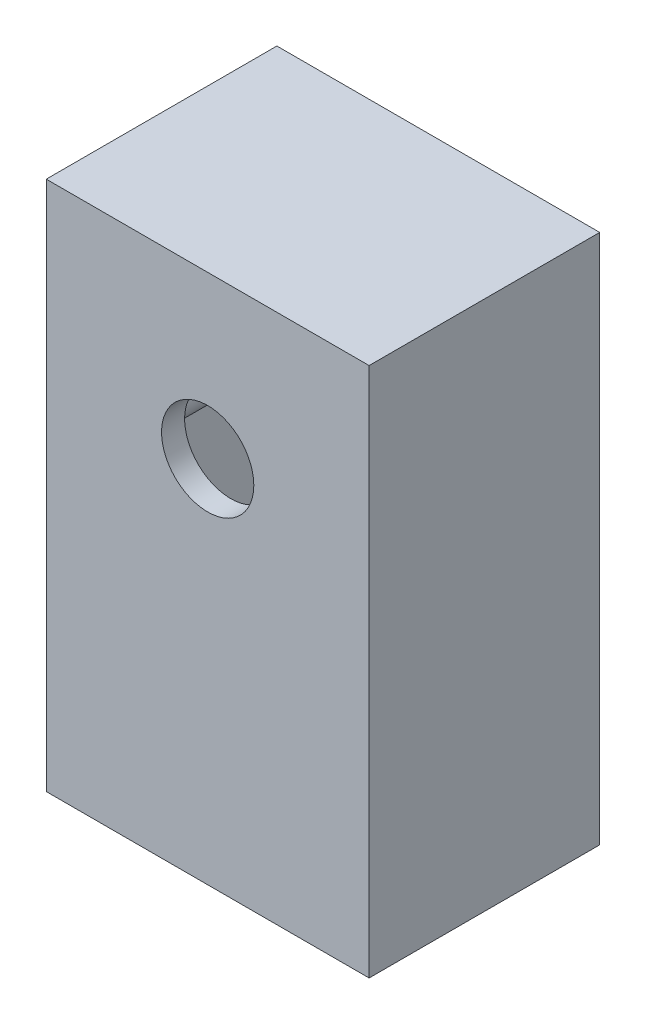
ISO-10303-21;
HEADER;
FILE_DESCRIPTION(('STEP AP214'),'2;1');
FILE_NAME('part.step','',(''),(''),'','','');
FILE_SCHEMA(('AUTOMOTIVE_DESIGN { 1 0 10303 214 1 1 1 1 }'));
ENDSEC;
DATA;
#1=APPLICATION_CONTEXT('core data for automotive mechanical design processes');
#2=APPLICATION_PROTOCOL_DEFINITION('international standard','automotive_design',2000,#1);
#3=PRODUCT_CONTEXT('',#1,'mechanical');
#4=PRODUCT('Part','Part','',(#3));
#5=PRODUCT_RELATED_PRODUCT_CATEGORY('part','',(#4));
#6=PRODUCT_DEFINITION_FORMATION('','',#4);
#7=PRODUCT_DEFINITION_CONTEXT('part definition',#1,'design');
#8=PRODUCT_DEFINITION('design','',#6,#7);
#9=PRODUCT_DEFINITION_SHAPE('','',#8);
#10=(LENGTH_UNIT() NAMED_UNIT(*) SI_UNIT(.MILLI.,.METRE.));
#11=(NAMED_UNIT(*) PLANE_ANGLE_UNIT() SI_UNIT($,.RADIAN.));
#12=(NAMED_UNIT(*) SI_UNIT($,.STERADIAN.) SOLID_ANGLE_UNIT());
#13=UNCERTAINTY_MEASURE_WITH_UNIT(LENGTH_MEASURE(1.E-05),#10,'distance_accuracy_value','');
#14=(GEOMETRIC_REPRESENTATION_CONTEXT(3) GLOBAL_UNCERTAINTY_ASSIGNED_CONTEXT((#13)) GLOBAL_UNIT_ASSIGNED_CONTEXT((#10,
#11,#12)) REPRESENTATION_CONTEXT('',''));
#15=CARTESIAN_POINT('',(0.,0.,0.));
#16=DIRECTION('',(0.,0.,1.));
#17=DIRECTION('',(1.,0.,0.));
#18=AXIS2_PLACEMENT_3D('',#15,#16,#17);
#19=CARTESIAN_POINT('',(0.,0.,-1000.));
#20=DIRECTION('',(0.,0.,1.));
#21=DIRECTION('',(1.,0.,0.));
#22=AXIS2_PLACEMENT_3D('',#19,#20,#21);
#23=PLANE('',#22);
#24=CARTESIAN_POINT('',(124743.416897498,168337.836627923,-1000.));
#25=DIRECTION('',(0.,0.,1.));
#26=DIRECTION('',(1.,0.,0.));
#27=AXIS2_PLACEMENT_3D('',#24,#25,#26);
#28=CIRCLE('',#27,2000.);
#29=CARTESIAN_POINT('',(126743.416897498,168337.836627923,-1000.));
#30=VERTEX_POINT('',#29);
#31=EDGE_CURVE('E435',#30,#30,#28,.T.);
#32=ORIENTED_EDGE('',*,*,#31,.T.);
#33=EDGE_LOOP('',(#32));
#34=FACE_BOUND('',#33,.T.);
#35=DIRECTION('',(0.,-1.,0.));
#36=VECTOR('',#35,1.);
#37=CARTESIAN_POINT('',(120743.416897498,157337.836627923,-1000.));
#38=LINE('',#37,#36);
#39=CARTESIAN_POINT('',(120743.416897498,157337.836627923,-1000.));
#40=VERTEX_POINT('',#39);
#41=CARTESIAN_POINT('',(120743.416897498,156337.836627923,-1000.));
#42=VERTEX_POINT('',#41);
#43=EDGE_CURVE('E257',#40,#42,#38,.T.);
#44=ORIENTED_EDGE('',*,*,#43,.F.);
#45=DIRECTION('',(-1.,0.,0.));
#46=VECTOR('',#45,1.);
#47=CARTESIAN_POINT('',(-1.48029736616685E-13,157337.836627923,-999.999999999984));
#48=LINE('',#47,#46);
#49=CARTESIAN_POINT('',(118743.416897498,157337.836627923,-1000.));
#50=VERTEX_POINT('',#49);
#51=EDGE_CURVE('E267',#40,#50,#48,.T.);
#52=ORIENTED_EDGE('',*,*,#51,.T.);
#53=DIRECTION('',(0.,1.,0.));
#54=VECTOR('',#53,1.);
#55=CARTESIAN_POINT('',(118743.416897498,0.,-1000.));
#56=LINE('',#55,#54);
#57=CARTESIAN_POINT('',(118743.416897498,166437.836627923,-1000.));
#58=VERTEX_POINT('',#57);
#59=EDGE_CURVE('E445',#50,#58,#56,.T.);
#60=ORIENTED_EDGE('',*,*,#59,.T.);
#61=DIRECTION('',(-1.,0.,0.));
#62=VECTOR('',#61,1.);
#63=CARTESIAN_POINT('',(0.,166437.836627923,-1000.));
#64=LINE('',#63,#62);
#65=CARTESIAN_POINT('',(120243.416897498,166437.836627923,-1000.));
#66=VERTEX_POINT('',#65);
#67=EDGE_CURVE('E490',#66,#58,#64,.T.);
#68=ORIENTED_EDGE('',*,*,#67,.F.);
#69=CARTESIAN_POINT('',(120243.416897498,167837.836627923,-1000.));
#70=DIRECTION('',(0.,0.,1.));
#71=DIRECTION('',(1.,0.,0.));
#72=AXIS2_PLACEMENT_3D('',#69,#70,#71);
#73=CIRCLE('',#72,1400.00000000001);
#74=CARTESIAN_POINT('',(121643.416897498,167837.836627923,-1000.));
#75=VERTEX_POINT('',#74);
#76=EDGE_CURVE('E487',#75,#66,#73,.F.);
#77=ORIENTED_EDGE('',*,*,#76,.F.);
#78=DIRECTION('',(0.,-1.,0.));
#79=VECTOR('',#78,1.);
#80=CARTESIAN_POINT('',(121643.416897501,1.72865692459113E-09,-1000.));
#81=LINE('',#80,#79);
#82=CARTESIAN_POINT('',(121643.416897498,168837.836627923,-1000.));
#83=VERTEX_POINT('',#82);
#84=EDGE_CURVE('E484',#83,#75,#81,.T.);
#85=ORIENTED_EDGE('',*,*,#84,.F.);
#86=CARTESIAN_POINT('',(120243.416897498,168837.836627923,-1000.));
#87=DIRECTION('',(0.,0.,1.));
#88=DIRECTION('',(1.,0.,0.));
#89=AXIS2_PLACEMENT_3D('',#86,#87,#88);
#90=CIRCLE('',#89,1400.00000000001);
#91=CARTESIAN_POINT('',(120243.416897498,170237.836627923,-1000.));
#92=VERTEX_POINT('',#91);
#93=EDGE_CURVE('E481',#92,#83,#90,.F.);
#94=ORIENTED_EDGE('',*,*,#93,.F.);
#95=DIRECTION('',(1.,0.,0.));
#96=VECTOR('',#95,1.);
#97=CARTESIAN_POINT('',(0.,170237.836627923,-1000.));
#98=LINE('',#97,#96);
#99=CARTESIAN_POINT('',(118743.416897498,170237.836627923,-1000.));
#100=VERTEX_POINT('',#99);
#101=EDGE_CURVE('E478',#100,#92,#98,.T.);
#102=ORIENTED_EDGE('',*,*,#101,.F.);
#103=DIRECTION('',(0.,1.,0.));
#104=VECTOR('',#103,1.);
#105=CARTESIAN_POINT('',(118743.416897499,4.11572059979761E-10,-1000.));
#106=LINE('',#105,#104);
#107=CARTESIAN_POINT('',(118743.416897498,174337.836627923,-1000.));
#108=VERTEX_POINT('',#107);
#109=EDGE_CURVE('E476',#100,#108,#106,.T.);
#110=ORIENTED_EDGE('',*,*,#109,.T.);
#111=DIRECTION('',(1.,0.,0.));
#112=VECTOR('',#111,1.);
#113=CARTESIAN_POINT('',(0.,174337.836627923,-1000.));
#114=LINE('',#113,#112);
#115=CARTESIAN_POINT('',(122843.416897498,174337.836627923,-1000.));
#116=VERTEX_POINT('',#115);
#117=EDGE_CURVE('E474',#108,#116,#114,.T.);
#118=ORIENTED_EDGE('',*,*,#117,.T.);
#119=DIRECTION('',(0.,-1.,0.));
#120=VECTOR('',#119,1.);
#121=CARTESIAN_POINT('',(122843.416897498,0.,-1000.));
#122=LINE('',#121,#120);
#123=CARTESIAN_POINT('',(122843.416897498,172837.836627923,-1000.));
#124=VERTEX_POINT('',#123);
#125=EDGE_CURVE('E472',#116,#124,#122,.T.);
#126=ORIENTED_EDGE('',*,*,#125,.T.);
#127=CARTESIAN_POINT('',(124243.416897498,172837.836627923,-1000.));
#128=DIRECTION('',(0.,0.,1.));
#129=DIRECTION('',(1.,0.,0.));
#130=AXIS2_PLACEMENT_3D('',#127,#128,#129);
#131=CIRCLE('',#130,1400.00000000001);
#132=CARTESIAN_POINT('',(124243.416897498,171437.836627923,-1000.));
#133=VERTEX_POINT('',#132);
#134=EDGE_CURVE('E470',#124,#133,#131,.T.);
#135=ORIENTED_EDGE('',*,*,#134,.T.);
#136=DIRECTION('',(1.,0.,0.));
#137=VECTOR('',#136,1.);
#138=CARTESIAN_POINT('',(0.,171437.836627923,-1000.));
#139=LINE('',#138,#137);
#140=CARTESIAN_POINT('',(125243.416897498,171437.836627923,-1000.));
#141=VERTEX_POINT('',#140);
#142=EDGE_CURVE('E468',#133,#141,#139,.T.);
#143=ORIENTED_EDGE('',*,*,#142,.T.);
#144=CARTESIAN_POINT('',(125243.416897498,172837.836627923,-1000.));
#145=DIRECTION('',(0.,0.,1.));
#146=DIRECTION('',(1.,0.,0.));
#147=AXIS2_PLACEMENT_3D('',#144,#145,#146);
#148=CIRCLE('',#147,1400.00000000001);
#149=CARTESIAN_POINT('',(126643.416897498,172837.836627923,-1000.));
#150=VERTEX_POINT('',#149);
#151=EDGE_CURVE('E466',#141,#150,#148,.T.);
#152=ORIENTED_EDGE('',*,*,#151,.T.);
#153=DIRECTION('',(0.,1.,0.));
#154=VECTOR('',#153,1.);
#155=CARTESIAN_POINT('',(126643.416897498,0.,-1000.));
#156=LINE('',#155,#154);
#157=CARTESIAN_POINT('',(126643.416897498,174337.836627923,-1000.));
#158=VERTEX_POINT('',#157);
#159=EDGE_CURVE('E464',#150,#158,#156,.T.);
#160=ORIENTED_EDGE('',*,*,#159,.T.);
#161=DIRECTION('',(1.,0.,0.));
#162=VECTOR('',#161,1.);
#163=CARTESIAN_POINT('',(0.,174337.836627923,-1000.));
#164=LINE('',#163,#162);
#165=CARTESIAN_POINT('',(130743.416897498,174337.836627923,-1000.));
#166=VERTEX_POINT('',#165);
#167=EDGE_CURVE('E462',#158,#166,#164,.T.);
#168=ORIENTED_EDGE('',*,*,#167,.T.);
#169=DIRECTION('',(0.,-1.,0.));
#170=VECTOR('',#169,1.);
#171=CARTESIAN_POINT('',(130743.416897498,0.,-1000.));
#172=LINE('',#171,#170);
#173=CARTESIAN_POINT('',(130743.416897498,170237.836627923,-1000.));
#174=VERTEX_POINT('',#173);
#175=EDGE_CURVE('E460',#166,#174,#172,.T.);
#176=ORIENTED_EDGE('',*,*,#175,.T.);
#177=DIRECTION('',(-1.,0.,0.));
#178=VECTOR('',#177,1.);
#179=CARTESIAN_POINT('',(0.,170237.836627923,-1000.));
#180=LINE('',#179,#178);
#181=CARTESIAN_POINT('',(129243.416897498,170237.836627923,-1000.));
#182=VERTEX_POINT('',#181);
#183=EDGE_CURVE('E458',#174,#182,#180,.T.);
#184=ORIENTED_EDGE('',*,*,#183,.T.);
#185=CARTESIAN_POINT('',(129243.416897498,168837.836627923,-1000.));
#186=DIRECTION('',(0.,0.,1.));
#187=DIRECTION('',(1.,0.,0.));
#188=AXIS2_PLACEMENT_3D('',#185,#186,#187);
#189=CIRCLE('',#188,1400.00000000001);
#190=CARTESIAN_POINT('',(127843.416897498,168837.836627923,-1000.));
#191=VERTEX_POINT('',#190);
#192=EDGE_CURVE('E456',#182,#191,#189,.T.);
#193=ORIENTED_EDGE('',*,*,#192,.T.);
#194=DIRECTION('',(0.,-1.,0.));
#195=VECTOR('',#194,1.);
#196=CARTESIAN_POINT('',(127843.416897496,-1.81676422382531E-09,-1000.));
#197=LINE('',#196,#195);
#198=CARTESIAN_POINT('',(127843.416897498,167837.836627923,-1000.));
#199=VERTEX_POINT('',#198);
#200=EDGE_CURVE('E454',#191,#199,#197,.T.);
#201=ORIENTED_EDGE('',*,*,#200,.T.);
#202=CARTESIAN_POINT('',(129243.416897498,167837.836627923,-1000.));
#203=DIRECTION('',(0.,0.,1.));
#204=DIRECTION('',(1.,0.,0.));
#205=AXIS2_PLACEMENT_3D('',#202,#203,#204);
#206=CIRCLE('',#205,1400.00000000001);
#207=CARTESIAN_POINT('',(129243.416897498,166437.836627923,-1000.));
#208=VERTEX_POINT('',#207);
#209=EDGE_CURVE('E452',#199,#208,#206,.T.);
#210=ORIENTED_EDGE('',*,*,#209,.T.);
#211=DIRECTION('',(1.,0.,0.));
#212=VECTOR('',#211,1.);
#213=CARTESIAN_POINT('',(0.,166437.836627923,-1000.));
#214=LINE('',#213,#212);
#215=CARTESIAN_POINT('',(130743.416897498,166437.836627923,-1000.));
#216=VERTEX_POINT('',#215);
#217=EDGE_CURVE('E450',#208,#216,#214,.T.);
#218=ORIENTED_EDGE('',*,*,#217,.T.);
#219=DIRECTION('',(0.,-1.,0.));
#220=VECTOR('',#219,1.);
#221=CARTESIAN_POINT('',(130743.416897498,0.,-1000.));
#222=LINE('',#221,#220);
#223=CARTESIAN_POINT('',(130743.416897498,157337.836627923,-1000.));
#224=VERTEX_POINT('',#223);
#225=EDGE_CURVE('E446',#216,#224,#222,.T.);
#226=ORIENTED_EDGE('',*,*,#225,.T.);
#227=DIRECTION('',(-1.,0.,0.));
#228=VECTOR('',#227,1.);
#229=CARTESIAN_POINT('',(-1.48029736616685E-13,157337.836627923,-999.999999999984));
#230=LINE('',#229,#228);
#231=CARTESIAN_POINT('',(128743.416897498,157337.836627923,-1000.));
#232=VERTEX_POINT('',#231);
#233=EDGE_CURVE('E275',#224,#232,#230,.T.);
#234=ORIENTED_EDGE('',*,*,#233,.T.);
#235=DIRECTION('',(0.,1.,0.));
#236=VECTOR('',#235,1.);
#237=CARTESIAN_POINT('',(128743.416897498,156337.836627923,-1000.));
#238=LINE('',#237,#236);
#239=CARTESIAN_POINT('',(128743.416897498,156337.836627923,-1000.));
#240=VERTEX_POINT('',#239);
#241=EDGE_CURVE('E60',#240,#232,#238,.T.);
#242=ORIENTED_EDGE('',*,*,#241,.F.);
#243=DIRECTION('',(-1.,0.,0.));
#244=VECTOR('',#243,1.);
#245=CARTESIAN_POINT('',(-1.48029736616685E-13,156337.836627923,-999.999999999984));
#246=LINE('',#245,#244);
#247=CARTESIAN_POINT('',(130743.416897498,156337.836627923,-1000.));
#248=VERTEX_POINT('',#247);
#249=EDGE_CURVE('E289',#248,#240,#246,.T.);
#250=ORIENTED_EDGE('',*,*,#249,.F.);
#251=CARTESIAN_POINT('',(130743.416897498,152337.836627923,-1000.));
#252=VERTEX_POINT('',#251);
#253=EDGE_CURVE('E449',#248,#252,#222,.T.);
#254=ORIENTED_EDGE('',*,*,#253,.T.);
#255=DIRECTION('',(1.,0.,0.));
#256=VECTOR('',#255,1.);
#257=CARTESIAN_POINT('',(0.,152337.836627923,-1000.));
#258=LINE('',#257,#256);
#259=CARTESIAN_POINT('',(118743.416897498,152337.836627923,-1000.));
#260=VERTEX_POINT('',#259);
#261=EDGE_CURVE('E433',#260,#252,#258,.T.);
#262=ORIENTED_EDGE('',*,*,#261,.F.);
#263=CARTESIAN_POINT('',(118743.416897498,156337.836627923,-1000.));
#264=VERTEX_POINT('',#263);
#265=EDGE_CURVE('E425',#260,#264,#56,.T.);
#266=ORIENTED_EDGE('',*,*,#265,.T.);
#267=DIRECTION('',(-1.,0.,0.));
#268=VECTOR('',#267,1.);
#269=CARTESIAN_POINT('',(-1.48029736616685E-13,156337.836627923,-999.999999999984));
#270=LINE('',#269,#268);
#271=EDGE_CURVE('E52',#42,#264,#270,.T.);
#272=ORIENTED_EDGE('',*,*,#271,.F.);
#273=EDGE_LOOP('',(#44,#52,#60,#68,#77,#85,#94,#102,#110,#118,#126,#135,#143,#152,#160,#168,
#176,#184,#193,#201,#210,#218,#226,#234,#242,#250,#254,#262,#266,#272));
#274=FACE_BOUND('',#273,.T.);
#275=ADVANCED_FACE('F35',(#34,#274),#23,.F.);
#276=CARTESIAN_POINT('',(130743.416897498,0.,-10000.));
#277=DIRECTION('',(-1.,0.,0.));
#278=DIRECTION('',(0.,0.,1.));
#279=AXIS2_PLACEMENT_3D('',#276,#277,#278);
#280=PLANE('',#279);
#281=ORIENTED_EDGE('',*,*,#253,.F.);
#282=DIRECTION('',(0.,0.,1.));
#283=VECTOR('',#282,1.);
#284=CARTESIAN_POINT('',(130743.416897498,156337.836627923,0.));
#285=LINE('',#284,#283);
#286=CARTESIAN_POINT('',(130743.416897498,156337.836627923,-8000.));
#287=VERTEX_POINT('',#286);
#288=EDGE_CURVE('E280',#287,#248,#285,.T.);
#289=ORIENTED_EDGE('',*,*,#288,.F.);
#290=DIRECTION('',(0.,1.,0.));
#291=VECTOR('',#290,1.);
#292=CARTESIAN_POINT('',(130743.416897498,156337.836627923,-8000.));
#293=LINE('',#292,#291);
#294=CARTESIAN_POINT('',(130743.416897498,157337.836627923,-8000.));
#295=VERTEX_POINT('',#294);
#296=EDGE_CURVE('E630',#287,#295,#293,.T.);
#297=ORIENTED_EDGE('',*,*,#296,.T.);
#298=DIRECTION('',(0.,0.,1.));
#299=VECTOR('',#298,1.);
#300=CARTESIAN_POINT('',(130743.416897498,157337.836627923,0.));
#301=LINE('',#300,#299);
#302=EDGE_CURVE('E263',#295,#224,#301,.T.);
#303=ORIENTED_EDGE('',*,*,#302,.T.);
#304=ORIENTED_EDGE('',*,*,#225,.F.);
#305=DIRECTION('',(0.,0.,1.));
#306=VECTOR('',#305,1.);
#307=CARTESIAN_POINT('',(130743.416897498,166437.836627923,-10000.));
#308=LINE('',#307,#306);
#309=CARTESIAN_POINT('',(130743.416897498,166437.836627923,-10000.));
#310=VERTEX_POINT('',#309);
#311=EDGE_CURVE('E552',#310,#216,#308,.T.);
#312=ORIENTED_EDGE('',*,*,#311,.F.);
#313=DIRECTION('',(0.,-1.,0.));
#314=VECTOR('',#313,1.);
#315=CARTESIAN_POINT('',(130743.416897498,0.,-10000.));
#316=LINE('',#315,#314);
#317=CARTESIAN_POINT('',(130743.416897498,152337.836627923,-10000.));
#318=VERTEX_POINT('',#317);
#319=EDGE_CURVE('E572',#310,#318,#316,.T.);
#320=ORIENTED_EDGE('',*,*,#319,.T.);
#321=DIRECTION('',(0.,0.,1.));
#322=VECTOR('',#321,1.);
#323=CARTESIAN_POINT('',(130743.416897498,152337.836627923,-10000.));
#324=LINE('',#323,#322);
#325=EDGE_CURVE('E555',#318,#252,#324,.T.);
#326=ORIENTED_EDGE('',*,*,#325,.T.);
#327=EDGE_LOOP('',(#281,#289,#297,#303,#304,#312,#320,#326));
#328=FACE_BOUND('',#327,.T.);
#329=ADVANCED_FACE('F307',(#328),#280,.T.);
#330=CARTESIAN_POINT('',(0.,152337.836627923,-1000.));
#331=DIRECTION('',(0.,-1.,0.));
#332=DIRECTION('',(0.,0.,-1.));
#333=AXIS2_PLACEMENT_3D('',#330,#331,#332);
#334=PLANE('',#333);
#335=DIRECTION('',(0.,0.,1.));
#336=VECTOR('',#335,1.);
#337=CARTESIAN_POINT('',(131743.416897498,152337.836627923,-1000.));
#338=LINE('',#337,#336);
#339=CARTESIAN_POINT('',(131743.416897498,152337.836627923,-10000.));
#340=VERTEX_POINT('',#339);
#341=CARTESIAN_POINT('',(131743.416897498,152337.836627923,0.));
#342=VERTEX_POINT('',#341);
#343=EDGE_CURVE('E39',#340,#342,#338,.T.);
#344=ORIENTED_EDGE('',*,*,#343,.T.);
#345=DIRECTION('',(1.,0.,0.));
#346=VECTOR('',#345,1.);
#347=CARTESIAN_POINT('',(0.,152337.836627923,0.));
#348=LINE('',#347,#346);
#349=CARTESIAN_POINT('',(117743.416897498,152337.836627923,0.));
#350=VERTEX_POINT('',#349);
#351=EDGE_CURVE('E421',#350,#342,#348,.T.);
#352=ORIENTED_EDGE('',*,*,#351,.F.);
#353=DIRECTION('',(0.,0.,1.));
#354=VECTOR('',#353,1.);
#355=CARTESIAN_POINT('',(117743.416897498,152337.836627923,-1000.));
#356=LINE('',#355,#354);
#357=CARTESIAN_POINT('',(117743.416897498,152337.836627923,-10000.));
#358=VERTEX_POINT('',#357);
#359=EDGE_CURVE('E11',#358,#350,#356,.T.);
#360=ORIENTED_EDGE('',*,*,#359,.F.);
#361=DIRECTION('',(1.,0.,0.));
#362=VECTOR('',#361,1.);
#363=CARTESIAN_POINT('',(0.,152337.836627923,-10000.));
#364=LINE('',#363,#362);
#365=CARTESIAN_POINT('',(118743.416897498,152337.836627923,-10000.));
#366=VERTEX_POINT('',#365);
#367=EDGE_CURVE('E498',#358,#366,#364,.T.);
#368=ORIENTED_EDGE('',*,*,#367,.T.);
#369=DIRECTION('',(0.,0.,1.));
#370=VECTOR('',#369,1.);
#371=CARTESIAN_POINT('',(118743.416897498,152337.836627923,-10000.));
#372=LINE('',#371,#370);
#373=EDGE_CURVE('E493',#366,#260,#372,.T.);
#374=ORIENTED_EDGE('',*,*,#373,.T.);
#375=ORIENTED_EDGE('',*,*,#261,.T.);
#376=ORIENTED_EDGE('',*,*,#325,.F.);
#377=DIRECTION('',(1.,0.,0.));
#378=VECTOR('',#377,1.);
#379=CARTESIAN_POINT('',(0.,152337.836627923,-10000.));
#380=LINE('',#379,#378);
#381=EDGE_CURVE('E570',#318,#340,#380,.T.);
#382=ORIENTED_EDGE('',*,*,#381,.T.);
#383=EDGE_LOOP('',(#344,#352,#360,#368,#374,#375,#376,#382));
#384=FACE_BOUND('',#383,.T.);
#385=ADVANCED_FACE('F37',(#384),#334,.T.);
#386=CARTESIAN_POINT('',(117743.416897498,0.,-1000.));
#387=DIRECTION('',(-1.,0.,0.));
#388=DIRECTION('',(0.,0.,1.));
#389=AXIS2_PLACEMENT_3D('',#386,#387,#388);
#390=PLANE('',#389);
#391=DIRECTION('',(0.,-1.,0.));
#392=VECTOR('',#391,1.);
#393=CARTESIAN_POINT('',(117743.416897498,0.,0.));
#394=LINE('',#393,#392);
#395=CARTESIAN_POINT('',(117743.416897498,175337.836627923,0.));
#396=VERTEX_POINT('',#395);
#397=EDGE_CURVE('E423',#396,#350,#394,.T.);
#398=ORIENTED_EDGE('',*,*,#397,.F.);
#399=DIRECTION('',(0.,0.,1.));
#400=VECTOR('',#399,1.);
#401=CARTESIAN_POINT('',(117743.416897498,175337.836627923,-1000.));
#402=LINE('',#401,#400);
#403=CARTESIAN_POINT('',(117743.416897498,175337.836627923,-10000.));
#404=VERTEX_POINT('',#403);
#405=EDGE_CURVE('E44',#404,#396,#402,.T.);
#406=ORIENTED_EDGE('',*,*,#405,.F.);
#407=DIRECTION('',(0.,-1.,0.));
#408=VECTOR('',#407,1.);
#409=CARTESIAN_POINT('',(117743.416897498,0.,-10000.));
#410=LINE('',#409,#408);
#411=EDGE_CURVE('E562',#404,#358,#410,.T.);
#412=ORIENTED_EDGE('',*,*,#411,.T.);
#413=ORIENTED_EDGE('',*,*,#359,.T.);
#414=EDGE_LOOP('',(#398,#406,#412,#413));
#415=FACE_BOUND('',#414,.T.);
#416=ADVANCED_FACE('F400',(#415),#390,.T.);
#417=CARTESIAN_POINT('',(0.,175337.836627923,-1000.));
#418=DIRECTION('',(0.,1.,0.));
#419=DIRECTION('',(0.,0.,1.));
#420=AXIS2_PLACEMENT_3D('',#417,#418,#419);
#421=PLANE('',#420);
#422=DIRECTION('',(-1.,0.,0.));
#423=VECTOR('',#422,1.);
#424=CARTESIAN_POINT('',(0.,175337.836627923,0.));
#425=LINE('',#424,#423);
#426=CARTESIAN_POINT('',(131743.416897498,175337.836627923,0.));
#427=VERTEX_POINT('',#426);
#428=EDGE_CURVE('E420',#427,#396,#425,.T.);
#429=ORIENTED_EDGE('',*,*,#428,.F.);
#430=DIRECTION('',(0.,0.,1.));
#431=VECTOR('',#430,1.);
#432=CARTESIAN_POINT('',(131743.416897498,175337.836627923,-1000.));
#433=LINE('',#432,#431);
#434=CARTESIAN_POINT('',(131743.416897498,175337.836627923,-10000.));
#435=VERTEX_POINT('',#434);
#436=EDGE_CURVE('E417',#435,#427,#433,.T.);
#437=ORIENTED_EDGE('',*,*,#436,.F.);
#438=DIRECTION('',(-1.,0.,0.));
#439=VECTOR('',#438,1.);
#440=CARTESIAN_POINT('',(0.,175337.836627923,-10000.));
#441=LINE('',#440,#439);
#442=EDGE_CURVE('E565',#435,#404,#441,.T.);
#443=ORIENTED_EDGE('',*,*,#442,.T.);
#444=ORIENTED_EDGE('',*,*,#405,.T.);
#445=EDGE_LOOP('',(#429,#437,#443,#444));
#446=FACE_BOUND('',#445,.T.);
#447=ADVANCED_FACE('F403',(#446),#421,.T.);
#448=CARTESIAN_POINT('',(131743.416897498,0.,-1000.));
#449=DIRECTION('',(1.,0.,0.));
#450=DIRECTION('',(0.,0.,-1.));
#451=AXIS2_PLACEMENT_3D('',#448,#449,#450);
#452=PLANE('',#451);
#453=DIRECTION('',(0.,1.,0.));
#454=VECTOR('',#453,1.);
#455=CARTESIAN_POINT('',(131743.416897498,0.,0.));
#456=LINE('',#455,#454);
#457=EDGE_CURVE('E413',#342,#427,#456,.T.);
#458=ORIENTED_EDGE('',*,*,#457,.F.);
#459=ORIENTED_EDGE('',*,*,#343,.F.);
#460=DIRECTION('',(0.,1.,0.));
#461=VECTOR('',#460,1.);
#462=CARTESIAN_POINT('',(131743.416897498,0.,-10000.));
#463=LINE('',#462,#461);
#464=EDGE_CURVE('E568',#340,#435,#463,.T.);
#465=ORIENTED_EDGE('',*,*,#464,.T.);
#466=ORIENTED_EDGE('',*,*,#436,.T.);
#467=EDGE_LOOP('',(#458,#459,#465,#466));
#468=FACE_BOUND('',#467,.T.);
#469=ADVANCED_FACE('F398',(#468),#452,.T.);
#470=CARTESIAN_POINT('',(124743.416897498,168337.836627923,-1000.));
#471=DIRECTION('',(0.,0.,1.));
#472=DIRECTION('',(1.,0.,0.));
#473=AXIS2_PLACEMENT_3D('',#470,#471,#472);
#474=CYLINDRICAL_SURFACE('',#473,2000.);
#475=ORIENTED_EDGE('',*,*,#31,.F.);
#476=EDGE_LOOP('',(#475));
#477=FACE_BOUND('',#476,.T.);
#478=CARTESIAN_POINT('',(124743.416897498,168337.836627923,0.));
#479=DIRECTION('',(0.,0.,1.));
#480=DIRECTION('',(1.,0.,0.));
#481=AXIS2_PLACEMENT_3D('',#478,#479,#480);
#482=CIRCLE('',#481,2000.);
#483=CARTESIAN_POINT('',(126743.416897498,168337.836627923,0.));
#484=VERTEX_POINT('',#483);
#485=EDGE_CURVE('E431',#484,#484,#482,.T.);
#486=ORIENTED_EDGE('',*,*,#485,.T.);
#487=EDGE_LOOP('',(#486));
#488=FACE_BOUND('',#487,.T.);
#489=ADVANCED_FACE('F394',(#477,#488),#474,.F.);
#490=CARTESIAN_POINT('',(0.,0.,0.));
#491=DIRECTION('',(0.,0.,1.));
#492=DIRECTION('',(1.,0.,0.));
#493=AXIS2_PLACEMENT_3D('',#490,#491,#492);
#494=PLANE('',#493);
#495=ORIENTED_EDGE('',*,*,#351,.T.);
#496=ORIENTED_EDGE('',*,*,#457,.T.);
#497=ORIENTED_EDGE('',*,*,#428,.T.);
#498=ORIENTED_EDGE('',*,*,#397,.T.);
#499=EDGE_LOOP('',(#495,#496,#497,#498));
#500=FACE_BOUND('',#499,.T.);
#501=ORIENTED_EDGE('',*,*,#485,.F.);
#502=EDGE_LOOP('',(#501));
#503=FACE_BOUND('',#502,.T.);
#504=ADVANCED_FACE('F388',(#500,#503),#494,.T.);
#505=CARTESIAN_POINT('',(118743.416897498,0.,-10000.));
#506=DIRECTION('',(1.,0.,0.));
#507=DIRECTION('',(0.,0.,-1.));
#508=AXIS2_PLACEMENT_3D('',#505,#506,#507);
#509=PLANE('',#508);
#510=DIRECTION('',(0.,0.,-1.));
#511=VECTOR('',#510,1.);
#512=CARTESIAN_POINT('',(118743.416897498,157337.836627923,0.));
#513=LINE('',#512,#511);
#514=CARTESIAN_POINT('',(118743.416897498,157337.836627923,-8000.));
#515=VERTEX_POINT('',#514);
#516=EDGE_CURVE('E262',#50,#515,#513,.T.);
#517=ORIENTED_EDGE('',*,*,#516,.T.);
#518=DIRECTION('',(0.,-1.,0.));
#519=VECTOR('',#518,1.);
#520=CARTESIAN_POINT('',(118743.416897498,157337.836627923,-8000.));
#521=LINE('',#520,#519);
#522=CARTESIAN_POINT('',(118743.416897498,156337.836627923,-8000.));
#523=VERTEX_POINT('',#522);
#524=EDGE_CURVE('E254',#515,#523,#521,.T.);
#525=ORIENTED_EDGE('',*,*,#524,.T.);
#526=DIRECTION('',(0.,0.,-1.));
#527=VECTOR('',#526,1.);
#528=CARTESIAN_POINT('',(118743.416897498,156337.836627923,0.));
#529=LINE('',#528,#527);
#530=EDGE_CURVE('E243',#264,#523,#529,.T.);
#531=ORIENTED_EDGE('',*,*,#530,.F.);
#532=ORIENTED_EDGE('',*,*,#265,.F.);
#533=ORIENTED_EDGE('',*,*,#373,.F.);
#534=DIRECTION('',(0.,1.,0.));
#535=VECTOR('',#534,1.);
#536=CARTESIAN_POINT('',(118743.416897498,0.,-10000.));
#537=LINE('',#536,#535);
#538=CARTESIAN_POINT('',(118743.416897498,166437.836627923,-10000.));
#539=VERTEX_POINT('',#538);
#540=EDGE_CURVE('E627',#366,#539,#537,.T.);
#541=ORIENTED_EDGE('',*,*,#540,.T.);
#542=DIRECTION('',(0.,0.,1.));
#543=VECTOR('',#542,1.);
#544=CARTESIAN_POINT('',(118743.416897498,166437.836627923,-10000.));
#545=LINE('',#544,#543);
#546=EDGE_CURVE('E494',#539,#58,#545,.T.);
#547=ORIENTED_EDGE('',*,*,#546,.T.);
#548=ORIENTED_EDGE('',*,*,#59,.F.);
#549=EDGE_LOOP('',(#517,#525,#531,#532,#533,#541,#547,#548));
#550=FACE_BOUND('',#549,.T.);
#551=ADVANCED_FACE('F260',(#550),#509,.T.);
#552=CARTESIAN_POINT('',(0.,166437.836627923,-10000.));
#553=DIRECTION('',(0.,-1.,0.));
#554=DIRECTION('',(0.,0.,-1.));
#555=AXIS2_PLACEMENT_3D('',#552,#553,#554);
#556=PLANE('',#555);
#557=ORIENTED_EDGE('',*,*,#217,.F.);
#558=DIRECTION('',(0.,0.,1.));
#559=VECTOR('',#558,1.);
#560=CARTESIAN_POINT('',(129243.416897498,166437.836627923,-10000.));
#561=LINE('',#560,#559);
#562=CARTESIAN_POINT('',(129243.416897498,166437.836627923,-10000.));
#563=VERTEX_POINT('',#562);
#564=EDGE_CURVE('E549',#563,#208,#561,.T.);
#565=ORIENTED_EDGE('',*,*,#564,.F.);
#566=DIRECTION('',(1.,0.,0.));
#567=VECTOR('',#566,1.);
#568=CARTESIAN_POINT('',(0.,166437.836627923,-10000.));
#569=LINE('',#568,#567);
#570=EDGE_CURVE('E575',#563,#310,#569,.T.);
#571=ORIENTED_EDGE('',*,*,#570,.T.);
#572=ORIENTED_EDGE('',*,*,#311,.T.);
#573=EDGE_LOOP('',(#557,#565,#571,#572));
#574=FACE_BOUND('',#573,.T.);
#575=ADVANCED_FACE('F311',(#574),#556,.T.);
#576=CARTESIAN_POINT('',(129243.416897498,167837.836627923,-10000.));
#577=DIRECTION('',(0.,0.,1.));
#578=DIRECTION('',(1.,0.,0.));
#579=AXIS2_PLACEMENT_3D('',#576,#577,#578);
#580=CYLINDRICAL_SURFACE('',#579,1400.00000000001);
#581=ORIENTED_EDGE('',*,*,#209,.F.);
#582=DIRECTION('',(0.,0.,1.));
#583=VECTOR('',#582,1.);
#584=CARTESIAN_POINT('',(127843.416897498,167837.836627923,-10000.));
#585=LINE('',#584,#583);
#586=CARTESIAN_POINT('',(127843.416897498,167837.836627923,-10000.));
#587=VERTEX_POINT('',#586);
#588=EDGE_CURVE('E546',#587,#199,#585,.T.);
#589=ORIENTED_EDGE('',*,*,#588,.F.);
#590=CARTESIAN_POINT('',(129243.416897498,167837.836627923,-10000.));
#591=DIRECTION('',(0.,0.,1.));
#592=DIRECTION('',(1.,0.,0.));
#593=AXIS2_PLACEMENT_3D('',#590,#591,#592);
#594=CIRCLE('',#593,1400.00000000001);
#595=EDGE_CURVE('E578',#587,#563,#594,.T.);
#596=ORIENTED_EDGE('',*,*,#595,.T.);
#597=ORIENTED_EDGE('',*,*,#564,.T.);
#598=EDGE_LOOP('',(#581,#589,#596,#597));
#599=FACE_BOUND('',#598,.T.);
#600=ADVANCED_FACE('F314',(#599),#580,.T.);
#601=CARTESIAN_POINT('',(127843.416897496,-1.81676422382531E-09,-10000.));
#602=DIRECTION('',(-1.,0.,0.));
#603=DIRECTION('',(0.,-1.,0.));
#604=AXIS2_PLACEMENT_3D('',#601,#602,#603);
#605=PLANE('',#604);
#606=ORIENTED_EDGE('',*,*,#200,.F.);
#607=DIRECTION('',(0.,0.,1.));
#608=VECTOR('',#607,1.);
#609=CARTESIAN_POINT('',(127843.416897498,168837.836627923,-10000.));
#610=LINE('',#609,#608);
#611=CARTESIAN_POINT('',(127843.416897498,168837.836627923,-10000.));
#612=VERTEX_POINT('',#611);
#613=EDGE_CURVE('E543',#612,#191,#610,.T.);
#614=ORIENTED_EDGE('',*,*,#613,.F.);
#615=DIRECTION('',(0.,-1.,0.));
#616=VECTOR('',#615,1.);
#617=CARTESIAN_POINT('',(127843.416897496,-1.81676422382531E-09,-10000.));
#618=LINE('',#617,#616);
#619=EDGE_CURVE('E581',#612,#587,#618,.T.);
#620=ORIENTED_EDGE('',*,*,#619,.T.);
#621=ORIENTED_EDGE('',*,*,#588,.T.);
#622=EDGE_LOOP('',(#606,#614,#620,#621));
#623=FACE_BOUND('',#622,.T.);
#624=ADVANCED_FACE('F318',(#623),#605,.T.);
#625=CARTESIAN_POINT('',(129243.416897498,168837.836627923,-10000.));
#626=DIRECTION('',(0.,0.,1.));
#627=DIRECTION('',(1.,0.,0.));
#628=AXIS2_PLACEMENT_3D('',#625,#626,#627);
#629=CYLINDRICAL_SURFACE('',#628,1400.00000000001);
#630=ORIENTED_EDGE('',*,*,#192,.F.);
#631=DIRECTION('',(0.,0.,1.));
#632=VECTOR('',#631,1.);
#633=CARTESIAN_POINT('',(129243.416897498,170237.836627923,-10000.));
#634=LINE('',#633,#632);
#635=CARTESIAN_POINT('',(129243.416897498,170237.836627923,-10000.));
#636=VERTEX_POINT('',#635);
#637=EDGE_CURVE('E540',#636,#182,#634,.T.);
#638=ORIENTED_EDGE('',*,*,#637,.F.);
#639=CARTESIAN_POINT('',(129243.416897498,168837.836627923,-10000.));
#640=DIRECTION('',(0.,0.,1.));
#641=DIRECTION('',(1.,0.,0.));
#642=AXIS2_PLACEMENT_3D('',#639,#640,#641);
#643=CIRCLE('',#642,1400.00000000001);
#644=EDGE_CURVE('E584',#636,#612,#643,.T.);
#645=ORIENTED_EDGE('',*,*,#644,.T.);
#646=ORIENTED_EDGE('',*,*,#613,.T.);
#647=EDGE_LOOP('',(#630,#638,#645,#646));
#648=FACE_BOUND('',#647,.T.);
#649=ADVANCED_FACE('F322',(#648),#629,.T.);
#650=CARTESIAN_POINT('',(0.,170237.836627923,-10000.));
#651=DIRECTION('',(0.,1.,0.));
#652=DIRECTION('',(0.,0.,1.));
#653=AXIS2_PLACEMENT_3D('',#650,#651,#652);
#654=PLANE('',#653);
#655=ORIENTED_EDGE('',*,*,#183,.F.);
#656=DIRECTION('',(0.,0.,1.));
#657=VECTOR('',#656,1.);
#658=CARTESIAN_POINT('',(130743.416897498,170237.836627923,-10000.));
#659=LINE('',#658,#657);
#660=CARTESIAN_POINT('',(130743.416897498,170237.836627923,-10000.));
#661=VERTEX_POINT('',#660);
#662=EDGE_CURVE('E537',#661,#174,#659,.T.);
#663=ORIENTED_EDGE('',*,*,#662,.F.);
#664=DIRECTION('',(-1.,0.,0.));
#665=VECTOR('',#664,1.);
#666=CARTESIAN_POINT('',(0.,170237.836627923,-10000.));
#667=LINE('',#666,#665);
#668=EDGE_CURVE('E587',#661,#636,#667,.T.);
#669=ORIENTED_EDGE('',*,*,#668,.T.);
#670=ORIENTED_EDGE('',*,*,#637,.T.);
#671=EDGE_LOOP('',(#655,#663,#669,#670));
#672=FACE_BOUND('',#671,.T.);
#673=ADVANCED_FACE('F326',(#672),#654,.T.);
#674=CARTESIAN_POINT('',(130743.416897498,0.,-10000.));
#675=DIRECTION('',(-1.,0.,0.));
#676=DIRECTION('',(0.,0.,1.));
#677=AXIS2_PLACEMENT_3D('',#674,#675,#676);
#678=PLANE('',#677);
#679=ORIENTED_EDGE('',*,*,#175,.F.);
#680=DIRECTION('',(0.,0.,1.));
#681=VECTOR('',#680,1.);
#682=CARTESIAN_POINT('',(130743.416897498,174337.836627923,-10000.));
#683=LINE('',#682,#681);
#684=CARTESIAN_POINT('',(130743.416897498,174337.836627923,-10000.));
#685=VERTEX_POINT('',#684);
#686=EDGE_CURVE('E534',#685,#166,#683,.T.);
#687=ORIENTED_EDGE('',*,*,#686,.F.);
#688=DIRECTION('',(0.,-1.,0.));
#689=VECTOR('',#688,1.);
#690=CARTESIAN_POINT('',(130743.416897498,0.,-10000.));
#691=LINE('',#690,#689);
#692=EDGE_CURVE('E590',#685,#661,#691,.T.);
#693=ORIENTED_EDGE('',*,*,#692,.T.);
#694=ORIENTED_EDGE('',*,*,#662,.T.);
#695=EDGE_LOOP('',(#679,#687,#693,#694));
#696=FACE_BOUND('',#695,.T.);
#697=ADVANCED_FACE('F330',(#696),#678,.T.);
#698=CARTESIAN_POINT('',(0.,174337.836627923,-10000.));
#699=DIRECTION('',(0.,-1.,0.));
#700=DIRECTION('',(0.,0.,-1.));
#701=AXIS2_PLACEMENT_3D('',#698,#699,#700);
#702=PLANE('',#701);
#703=ORIENTED_EDGE('',*,*,#167,.F.);
#704=DIRECTION('',(0.,0.,1.));
#705=VECTOR('',#704,1.);
#706=CARTESIAN_POINT('',(126643.416897498,174337.836627923,-10000.));
#707=LINE('',#706,#705);
#708=CARTESIAN_POINT('',(126643.416897498,174337.836627923,-10000.));
#709=VERTEX_POINT('',#708);
#710=EDGE_CURVE('E531',#709,#158,#707,.T.);
#711=ORIENTED_EDGE('',*,*,#710,.F.);
#712=DIRECTION('',(1.,0.,0.));
#713=VECTOR('',#712,1.);
#714=CARTESIAN_POINT('',(0.,174337.836627923,-10000.));
#715=LINE('',#714,#713);
#716=EDGE_CURVE('E593',#709,#685,#715,.T.);
#717=ORIENTED_EDGE('',*,*,#716,.T.);
#718=ORIENTED_EDGE('',*,*,#686,.T.);
#719=EDGE_LOOP('',(#703,#711,#717,#718));
#720=FACE_BOUND('',#719,.T.);
#721=ADVANCED_FACE('F334',(#720),#702,.T.);
#722=CARTESIAN_POINT('',(126643.416897498,0.,-10000.));
#723=DIRECTION('',(1.,0.,0.));
#724=DIRECTION('',(0.,0.,-1.));
#725=AXIS2_PLACEMENT_3D('',#722,#723,#724);
#726=PLANE('',#725);
#727=ORIENTED_EDGE('',*,*,#159,.F.);
#728=DIRECTION('',(0.,0.,1.));
#729=VECTOR('',#728,1.);
#730=CARTESIAN_POINT('',(126643.416897498,172837.836627923,-10000.));
#731=LINE('',#730,#729);
#732=CARTESIAN_POINT('',(126643.416897498,172837.836627923,-10000.));
#733=VERTEX_POINT('',#732);
#734=EDGE_CURVE('E528',#733,#150,#731,.T.);
#735=ORIENTED_EDGE('',*,*,#734,.F.);
#736=DIRECTION('',(0.,1.,0.));
#737=VECTOR('',#736,1.);
#738=CARTESIAN_POINT('',(126643.416897498,0.,-10000.));
#739=LINE('',#738,#737);
#740=EDGE_CURVE('E596',#733,#709,#739,.T.);
#741=ORIENTED_EDGE('',*,*,#740,.T.);
#742=ORIENTED_EDGE('',*,*,#710,.T.);
#743=EDGE_LOOP('',(#727,#735,#741,#742));
#744=FACE_BOUND('',#743,.T.);
#745=ADVANCED_FACE('F338',(#744),#726,.T.);
#746=CARTESIAN_POINT('',(125243.416897498,172837.836627923,-10000.));
#747=DIRECTION('',(0.,0.,1.));
#748=DIRECTION('',(1.,0.,0.));
#749=AXIS2_PLACEMENT_3D('',#746,#747,#748);
#750=CYLINDRICAL_SURFACE('',#749,1400.00000000001);
#751=ORIENTED_EDGE('',*,*,#151,.F.);
#752=DIRECTION('',(0.,0.,1.));
#753=VECTOR('',#752,1.);
#754=CARTESIAN_POINT('',(125243.416897498,171437.836627923,-10000.));
#755=LINE('',#754,#753);
#756=CARTESIAN_POINT('',(125243.416897498,171437.836627923,-10000.));
#757=VERTEX_POINT('',#756);
#758=EDGE_CURVE('E525',#757,#141,#755,.T.);
#759=ORIENTED_EDGE('',*,*,#758,.F.);
#760=CARTESIAN_POINT('',(125243.416897498,172837.836627923,-10000.));
#761=DIRECTION('',(0.,0.,1.));
#762=DIRECTION('',(1.,0.,0.));
#763=AXIS2_PLACEMENT_3D('',#760,#761,#762);
#764=CIRCLE('',#763,1400.00000000001);
#765=EDGE_CURVE('E599',#757,#733,#764,.T.);
#766=ORIENTED_EDGE('',*,*,#765,.T.);
#767=ORIENTED_EDGE('',*,*,#734,.T.);
#768=EDGE_LOOP('',(#751,#759,#766,#767));
#769=FACE_BOUND('',#768,.T.);
#770=ADVANCED_FACE('F342',(#769),#750,.T.);
#771=CARTESIAN_POINT('',(0.,171437.836627923,-10000.));
#772=DIRECTION('',(0.,-1.,0.));
#773=DIRECTION('',(0.,0.,-1.));
#774=AXIS2_PLACEMENT_3D('',#771,#772,#773);
#775=PLANE('',#774);
#776=ORIENTED_EDGE('',*,*,#142,.F.);
#777=DIRECTION('',(0.,0.,1.));
#778=VECTOR('',#777,1.);
#779=CARTESIAN_POINT('',(124243.416897498,171437.836627923,-10000.));
#780=LINE('',#779,#778);
#781=CARTESIAN_POINT('',(124243.416897498,171437.836627923,-10000.));
#782=VERTEX_POINT('',#781);
#783=EDGE_CURVE('E522',#782,#133,#780,.T.);
#784=ORIENTED_EDGE('',*,*,#783,.F.);
#785=DIRECTION('',(1.,0.,0.));
#786=VECTOR('',#785,1.);
#787=CARTESIAN_POINT('',(0.,171437.836627923,-10000.));
#788=LINE('',#787,#786);
#789=EDGE_CURVE('E602',#782,#757,#788,.T.);
#790=ORIENTED_EDGE('',*,*,#789,.T.);
#791=ORIENTED_EDGE('',*,*,#758,.T.);
#792=EDGE_LOOP('',(#776,#784,#790,#791));
#793=FACE_BOUND('',#792,.T.);
#794=ADVANCED_FACE('F346',(#793),#775,.T.);
#795=CARTESIAN_POINT('',(124243.416897498,172837.836627923,-10000.));
#796=DIRECTION('',(0.,0.,1.));
#797=DIRECTION('',(1.,0.,0.));
#798=AXIS2_PLACEMENT_3D('',#795,#796,#797);
#799=CYLINDRICAL_SURFACE('',#798,1400.00000000001);
#800=ORIENTED_EDGE('',*,*,#134,.F.);
#801=DIRECTION('',(0.,0.,1.));
#802=VECTOR('',#801,1.);
#803=CARTESIAN_POINT('',(122843.416897498,172837.836627923,-10000.));
#804=LINE('',#803,#802);
#805=CARTESIAN_POINT('',(122843.416897498,172837.836627923,-10000.));
#806=VERTEX_POINT('',#805);
#807=EDGE_CURVE('E519',#806,#124,#804,.T.);
#808=ORIENTED_EDGE('',*,*,#807,.F.);
#809=CARTESIAN_POINT('',(124243.416897498,172837.836627923,-10000.));
#810=DIRECTION('',(0.,0.,1.));
#811=DIRECTION('',(1.,0.,0.));
#812=AXIS2_PLACEMENT_3D('',#809,#810,#811);
#813=CIRCLE('',#812,1400.00000000001);
#814=EDGE_CURVE('E605',#806,#782,#813,.T.);
#815=ORIENTED_EDGE('',*,*,#814,.T.);
#816=ORIENTED_EDGE('',*,*,#783,.T.);
#817=EDGE_LOOP('',(#800,#808,#815,#816));
#818=FACE_BOUND('',#817,.T.);
#819=ADVANCED_FACE('F350',(#818),#799,.T.);
#820=CARTESIAN_POINT('',(122843.416897498,0.,-10000.));
#821=DIRECTION('',(-1.,0.,0.));
#822=DIRECTION('',(0.,0.,1.));
#823=AXIS2_PLACEMENT_3D('',#820,#821,#822);
#824=PLANE('',#823);
#825=ORIENTED_EDGE('',*,*,#125,.F.);
#826=DIRECTION('',(0.,0.,1.));
#827=VECTOR('',#826,1.);
#828=CARTESIAN_POINT('',(122843.416897498,174337.836627923,-10000.));
#829=LINE('',#828,#827);
#830=CARTESIAN_POINT('',(122843.416897498,174337.836627923,-10000.));
#831=VERTEX_POINT('',#830);
#832=EDGE_CURVE('E516',#831,#116,#829,.T.);
#833=ORIENTED_EDGE('',*,*,#832,.F.);
#834=DIRECTION('',(0.,-1.,0.));
#835=VECTOR('',#834,1.);
#836=CARTESIAN_POINT('',(122843.416897498,0.,-10000.));
#837=LINE('',#836,#835);
#838=EDGE_CURVE('E608',#831,#806,#837,.T.);
#839=ORIENTED_EDGE('',*,*,#838,.T.);
#840=ORIENTED_EDGE('',*,*,#807,.T.);
#841=EDGE_LOOP('',(#825,#833,#839,#840));
#842=FACE_BOUND('',#841,.T.);
#843=ADVANCED_FACE('F354',(#842),#824,.T.);
#844=CARTESIAN_POINT('',(0.,174337.836627923,-10000.));
#845=DIRECTION('',(0.,-1.,0.));
#846=DIRECTION('',(0.,0.,-1.));
#847=AXIS2_PLACEMENT_3D('',#844,#845,#846);
#848=PLANE('',#847);
#849=ORIENTED_EDGE('',*,*,#117,.F.);
#850=DIRECTION('',(0.,0.,1.));
#851=VECTOR('',#850,1.);
#852=CARTESIAN_POINT('',(118743.416897498,174337.836627923,-10000.));
#853=LINE('',#852,#851);
#854=CARTESIAN_POINT('',(118743.416897498,174337.836627923,-10000.));
#855=VERTEX_POINT('',#854);
#856=EDGE_CURVE('E513',#855,#108,#853,.T.);
#857=ORIENTED_EDGE('',*,*,#856,.F.);
#858=DIRECTION('',(1.,0.,0.));
#859=VECTOR('',#858,1.);
#860=CARTESIAN_POINT('',(0.,174337.836627923,-10000.));
#861=LINE('',#860,#859);
#862=EDGE_CURVE('E611',#855,#831,#861,.T.);
#863=ORIENTED_EDGE('',*,*,#862,.T.);
#864=ORIENTED_EDGE('',*,*,#832,.T.);
#865=EDGE_LOOP('',(#849,#857,#863,#864));
#866=FACE_BOUND('',#865,.T.);
#867=ADVANCED_FACE('F358',(#866),#848,.T.);
#868=CARTESIAN_POINT('',(118743.416897499,4.11572059979761E-10,-10000.));
#869=DIRECTION('',(1.,0.,0.));
#870=DIRECTION('',(0.,1.,0.));
#871=AXIS2_PLACEMENT_3D('',#868,#869,#870);
#872=PLANE('',#871);
#873=ORIENTED_EDGE('',*,*,#109,.F.);
#874=DIRECTION('',(0.,0.,1.));
#875=VECTOR('',#874,1.);
#876=CARTESIAN_POINT('',(118743.416897498,170237.836627923,-10000.));
#877=LINE('',#876,#875);
#878=CARTESIAN_POINT('',(118743.416897498,170237.836627923,-10000.));
#879=VERTEX_POINT('',#878);
#880=EDGE_CURVE('E510',#879,#100,#877,.T.);
#881=ORIENTED_EDGE('',*,*,#880,.F.);
#882=DIRECTION('',(0.,1.,0.));
#883=VECTOR('',#882,1.);
#884=CARTESIAN_POINT('',(118743.416897499,4.11572059979761E-10,-10000.));
#885=LINE('',#884,#883);
#886=EDGE_CURVE('E614',#879,#855,#885,.T.);
#887=ORIENTED_EDGE('',*,*,#886,.T.);
#888=ORIENTED_EDGE('',*,*,#856,.T.);
#889=EDGE_LOOP('',(#873,#881,#887,#888));
#890=FACE_BOUND('',#889,.T.);
#891=ADVANCED_FACE('F362',(#890),#872,.T.);
#892=CARTESIAN_POINT('',(0.,170237.836627923,-10000.));
#893=DIRECTION('',(0.,-1.,0.));
#894=DIRECTION('',(0.,0.,-1.));
#895=AXIS2_PLACEMENT_3D('',#892,#893,#894);
#896=PLANE('',#895);
#897=ORIENTED_EDGE('',*,*,#880,.T.);
#898=ORIENTED_EDGE('',*,*,#101,.T.);
#899=DIRECTION('',(0.,0.,1.));
#900=VECTOR('',#899,1.);
#901=CARTESIAN_POINT('',(120243.416897498,170237.836627923,-10000.));
#902=LINE('',#901,#900);
#903=CARTESIAN_POINT('',(120243.416897498,170237.836627923,-10000.));
#904=VERTEX_POINT('',#903);
#905=EDGE_CURVE('E507',#904,#92,#902,.T.);
#906=ORIENTED_EDGE('',*,*,#905,.F.);
#907=DIRECTION('',(1.,0.,0.));
#908=VECTOR('',#907,1.);
#909=CARTESIAN_POINT('',(0.,170237.836627923,-10000.));
#910=LINE('',#909,#908);
#911=EDGE_CURVE('E617',#879,#904,#910,.T.);
#912=ORIENTED_EDGE('',*,*,#911,.F.);
#913=EDGE_LOOP('',(#897,#898,#906,#912));
#914=FACE_BOUND('',#913,.T.);
#915=ADVANCED_FACE('F366',(#914),#896,.F.);
#916=CARTESIAN_POINT('',(120243.416897498,168837.836627923,-10000.));
#917=DIRECTION('',(0.,0.,1.));
#918=DIRECTION('',(1.,0.,0.));
#919=AXIS2_PLACEMENT_3D('',#916,#917,#918);
#920=CYLINDRICAL_SURFACE('',#919,1400.00000000001);
#921=ORIENTED_EDGE('',*,*,#905,.T.);
#922=ORIENTED_EDGE('',*,*,#93,.T.);
#923=DIRECTION('',(0.,0.,1.));
#924=VECTOR('',#923,1.);
#925=CARTESIAN_POINT('',(121643.416897498,168837.836627923,-10000.));
#926=LINE('',#925,#924);
#927=CARTESIAN_POINT('',(121643.416897498,168837.836627923,-10000.));
#928=VERTEX_POINT('',#927);
#929=EDGE_CURVE('E504',#928,#83,#926,.T.);
#930=ORIENTED_EDGE('',*,*,#929,.F.);
#931=CARTESIAN_POINT('',(120243.416897498,168837.836627923,-10000.));
#932=DIRECTION('',(0.,0.,1.));
#933=DIRECTION('',(1.,0.,0.));
#934=AXIS2_PLACEMENT_3D('',#931,#932,#933);
#935=CIRCLE('',#934,1400.00000000001);
#936=EDGE_CURVE('E619',#904,#928,#935,.F.);
#937=ORIENTED_EDGE('',*,*,#936,.F.);
#938=EDGE_LOOP('',(#921,#922,#930,#937));
#939=FACE_BOUND('',#938,.T.);
#940=ADVANCED_FACE('F370',(#939),#920,.T.);
#941=CARTESIAN_POINT('',(121643.416897501,1.72865692459113E-09,-10000.));
#942=DIRECTION('',(-1.,0.,0.));
#943=DIRECTION('',(0.,-1.,0.));
#944=AXIS2_PLACEMENT_3D('',#941,#942,#943);
#945=PLANE('',#944);
#946=ORIENTED_EDGE('',*,*,#929,.T.);
#947=ORIENTED_EDGE('',*,*,#84,.T.);
#948=DIRECTION('',(0.,0.,1.));
#949=VECTOR('',#948,1.);
#950=CARTESIAN_POINT('',(121643.416897498,167837.836627923,-10000.));
#951=LINE('',#950,#949);
#952=CARTESIAN_POINT('',(121643.416897498,167837.836627923,-10000.));
#953=VERTEX_POINT('',#952);
#954=EDGE_CURVE('E501',#953,#75,#951,.T.);
#955=ORIENTED_EDGE('',*,*,#954,.F.);
#956=DIRECTION('',(0.,-1.,0.));
#957=VECTOR('',#956,1.);
#958=CARTESIAN_POINT('',(121643.416897501,1.72865692459113E-09,-10000.));
#959=LINE('',#958,#957);
#960=EDGE_CURVE('E621',#928,#953,#959,.T.);
#961=ORIENTED_EDGE('',*,*,#960,.F.);
#962=EDGE_LOOP('',(#946,#947,#955,#961));
#963=FACE_BOUND('',#962,.T.);
#964=ADVANCED_FACE('F374',(#963),#945,.F.);
#965=CARTESIAN_POINT('',(120243.416897498,167837.836627923,-10000.));
#966=DIRECTION('',(0.,0.,1.));
#967=DIRECTION('',(1.,0.,0.));
#968=AXIS2_PLACEMENT_3D('',#965,#966,#967);
#969=CYLINDRICAL_SURFACE('',#968,1400.00000000001);
#970=ORIENTED_EDGE('',*,*,#954,.T.);
#971=ORIENTED_EDGE('',*,*,#76,.T.);
#972=DIRECTION('',(0.,0.,1.));
#973=VECTOR('',#972,1.);
#974=CARTESIAN_POINT('',(120243.416897498,166437.836627923,-10000.));
#975=LINE('',#974,#973);
#976=CARTESIAN_POINT('',(120243.416897498,166437.836627923,-10000.));
#977=VERTEX_POINT('',#976);
#978=EDGE_CURVE('E497',#977,#66,#975,.T.);
#979=ORIENTED_EDGE('',*,*,#978,.F.);
#980=CARTESIAN_POINT('',(120243.416897498,167837.836627923,-10000.));
#981=DIRECTION('',(0.,0.,1.));
#982=DIRECTION('',(1.,0.,0.));
#983=AXIS2_PLACEMENT_3D('',#980,#981,#982);
#984=CIRCLE('',#983,1400.00000000001);
#985=EDGE_CURVE('E623',#953,#977,#984,.F.);
#986=ORIENTED_EDGE('',*,*,#985,.F.);
#987=EDGE_LOOP('',(#970,#971,#979,#986));
#988=FACE_BOUND('',#987,.T.);
#989=ADVANCED_FACE('F378',(#988),#969,.T.);
#990=CARTESIAN_POINT('',(0.,166437.836627923,-10000.));
#991=DIRECTION('',(0.,1.,0.));
#992=DIRECTION('',(0.,0.,1.));
#993=AXIS2_PLACEMENT_3D('',#990,#991,#992);
#994=PLANE('',#993);
#995=ORIENTED_EDGE('',*,*,#978,.T.);
#996=ORIENTED_EDGE('',*,*,#67,.T.);
#997=ORIENTED_EDGE('',*,*,#546,.F.);
#998=DIRECTION('',(-1.,0.,0.));
#999=VECTOR('',#998,1.);
#1000=CARTESIAN_POINT('',(0.,166437.836627923,-10000.));
#1001=LINE('',#1000,#999);
#1002=EDGE_CURVE('E625',#977,#539,#1001,.T.);
#1003=ORIENTED_EDGE('',*,*,#1002,.F.);
#1004=EDGE_LOOP('',(#995,#996,#997,#1003));
#1005=FACE_BOUND('',#1004,.T.);
#1006=ADVANCED_FACE('F305',(#1005),#994,.F.);
#1007=CARTESIAN_POINT('',(0.,0.,-10000.));
#1008=DIRECTION('',(0.,0.,1.));
#1009=DIRECTION('',(1.,0.,0.));
#1010=AXIS2_PLACEMENT_3D('',#1007,#1008,#1009);
#1011=PLANE('',#1010);
#1012=ORIENTED_EDGE('',*,*,#540,.F.);
#1013=ORIENTED_EDGE('',*,*,#367,.F.);
#1014=ORIENTED_EDGE('',*,*,#411,.F.);
#1015=ORIENTED_EDGE('',*,*,#442,.F.);
#1016=ORIENTED_EDGE('',*,*,#464,.F.);
#1017=ORIENTED_EDGE('',*,*,#381,.F.);
#1018=ORIENTED_EDGE('',*,*,#319,.F.);
#1019=ORIENTED_EDGE('',*,*,#570,.F.);
#1020=ORIENTED_EDGE('',*,*,#595,.F.);
#1021=ORIENTED_EDGE('',*,*,#619,.F.);
#1022=ORIENTED_EDGE('',*,*,#644,.F.);
#1023=ORIENTED_EDGE('',*,*,#668,.F.);
#1024=ORIENTED_EDGE('',*,*,#692,.F.);
#1025=ORIENTED_EDGE('',*,*,#716,.F.);
#1026=ORIENTED_EDGE('',*,*,#740,.F.);
#1027=ORIENTED_EDGE('',*,*,#765,.F.);
#1028=ORIENTED_EDGE('',*,*,#789,.F.);
#1029=ORIENTED_EDGE('',*,*,#814,.F.);
#1030=ORIENTED_EDGE('',*,*,#838,.F.);
#1031=ORIENTED_EDGE('',*,*,#862,.F.);
#1032=ORIENTED_EDGE('',*,*,#886,.F.);
#1033=ORIENTED_EDGE('',*,*,#911,.T.);
#1034=ORIENTED_EDGE('',*,*,#936,.T.);
#1035=ORIENTED_EDGE('',*,*,#960,.T.);
#1036=ORIENTED_EDGE('',*,*,#985,.T.);
#1037=ORIENTED_EDGE('',*,*,#1002,.T.);
#1038=EDGE_LOOP('',(#1012,#1013,#1014,#1015,#1016,#1017,#1018,#1019,#1020,#1021,#1022,#1023,
#1024,#1025,#1026,#1027,#1028,#1029,#1030,#1031,#1032,#1033,#1034,#1035,#1036,#1037));
#1039=FACE_BOUND('',#1038,.T.);
#1040=ADVANCED_FACE('F300',(#1039),#1011,.F.);
#1041=CARTESIAN_POINT('',(130743.416897498,156337.836627923,-8000.));
#1042=CARTESIAN_POINT('',(128761.675222051,156337.836627923,-7234.34826225637));
#1043=CARTESIAN_POINT('',(128743.416897498,156337.836627923,-1000.));
#1044=B_SPLINE_CURVE_WITH_KNOTS('',2,(#1041,#1042,#1043),.UNSPECIFIED.,.F.,.F.,(3,3),(0.,
0.590989183690971),.UNSPECIFIED.);
#1045=DIRECTION('',(0.,1.,0.));
#1046=VECTOR('',#1045,1.);
#1047=SURFACE_OF_LINEAR_EXTRUSION('',#1044,#1046);
#1048=CARTESIAN_POINT('',(130743.416897498,157337.836627923,-8000.));
#1049=CARTESIAN_POINT('',(128761.675222051,157337.836627923,-7234.34826225637));
#1050=CARTESIAN_POINT('',(128743.416897498,157337.836627923,-1000.));
#1051=B_SPLINE_CURVE_WITH_KNOTS('',2,(#1048,#1049,#1050),.UNSPECIFIED.,.F.,.F.,(3,3),(0.,
0.590989183690971),.UNSPECIFIED.);
#1052=EDGE_CURVE('E265',#295,#232,#1051,.T.);
#1053=ORIENTED_EDGE('',*,*,#1052,.F.);
#1054=ORIENTED_EDGE('',*,*,#296,.F.);
#1055=EDGE_CURVE('E283',#287,#240,#1044,.T.);
#1056=ORIENTED_EDGE('',*,*,#1055,.T.);
#1057=ORIENTED_EDGE('',*,*,#241,.T.);
#1058=EDGE_LOOP('',(#1053,#1054,#1056,#1057));
#1059=FACE_BOUND('',#1058,.T.);
#1060=ADVANCED_FACE('F295',(#1059),#1047,.T.);
#1061=CARTESIAN_POINT('',(0.,156337.836627923,0.));
#1062=DIRECTION('',(0.,1.,0.));
#1063=DIRECTION('',(0.,0.,1.));
#1064=AXIS2_PLACEMENT_3D('',#1061,#1062,#1063);
#1065=PLANE('',#1064);
#1066=ORIENTED_EDGE('',*,*,#288,.T.);
#1067=ORIENTED_EDGE('',*,*,#249,.T.);
#1068=ORIENTED_EDGE('',*,*,#1055,.F.);
#1069=EDGE_LOOP('',(#1066,#1067,#1068));
#1070=FACE_BOUND('',#1069,.T.);
#1071=ADVANCED_FACE('F299',(#1070),#1065,.F.);
#1072=CARTESIAN_POINT('',(0.,157337.836627923,0.));
#1073=DIRECTION('',(0.,1.,0.));
#1074=DIRECTION('',(0.,0.,1.));
#1075=AXIS2_PLACEMENT_3D('',#1072,#1073,#1074);
#1076=PLANE('',#1075);
#1077=ORIENTED_EDGE('',*,*,#302,.F.);
#1078=ORIENTED_EDGE('',*,*,#1052,.T.);
#1079=ORIENTED_EDGE('',*,*,#233,.F.);
#1080=EDGE_LOOP('',(#1077,#1078,#1079));
#1081=FACE_BOUND('',#1080,.T.);
#1082=ADVANCED_FACE('F637',(#1081),#1076,.T.);
#1083=CARTESIAN_POINT('',(118743.416897498,157337.836627923,-8000.));
#1084=CARTESIAN_POINT('',(120739.811138244,157337.836627923,-7120.57879478349));
#1085=CARTESIAN_POINT('',(120743.416897498,157337.836627923,-1000.));
#1086=B_SPLINE_CURVE_WITH_KNOTS('',2,(#1083,#1084,#1085),.UNSPECIFIED.,.F.,.F.,(3,3),(0.,
0.514460754981737),.UNSPECIFIED.);
#1087=DIRECTION('',(0.,-1.,0.));
#1088=VECTOR('',#1087,1.);
#1089=SURFACE_OF_LINEAR_EXTRUSION('',#1086,#1088);
#1090=ORIENTED_EDGE('',*,*,#43,.T.);
#1091=CARTESIAN_POINT('',(118743.416897498,156337.836627923,-8000.));
#1092=CARTESIAN_POINT('',(120739.811138244,156337.836627923,-7120.57879478349));
#1093=CARTESIAN_POINT('',(120743.416897498,156337.836627923,-1000.));
#1094=B_SPLINE_CURVE_WITH_KNOTS('',2,(#1091,#1092,#1093),.UNSPECIFIED.,.F.,.F.,(3,3),(0.,
0.514460754981737),.UNSPECIFIED.);
#1095=EDGE_CURVE('E246',#523,#42,#1094,.T.);
#1096=ORIENTED_EDGE('',*,*,#1095,.F.);
#1097=ORIENTED_EDGE('',*,*,#524,.F.);
#1098=EDGE_CURVE('E701',#515,#40,#1086,.T.);
#1099=ORIENTED_EDGE('',*,*,#1098,.T.);
#1100=EDGE_LOOP('',(#1090,#1096,#1097,#1099));
#1101=FACE_BOUND('',#1100,.T.);
#1102=ADVANCED_FACE('F253',(#1101),#1089,.T.);
#1103=CARTESIAN_POINT('',(0.,157337.836627923,0.));
#1104=DIRECTION('',(0.,1.,0.));
#1105=DIRECTION('',(0.,0.,1.));
#1106=AXIS2_PLACEMENT_3D('',#1103,#1104,#1105);
#1107=PLANE('',#1106);
#1108=ORIENTED_EDGE('',*,*,#1098,.F.);
#1109=ORIENTED_EDGE('',*,*,#516,.F.);
#1110=ORIENTED_EDGE('',*,*,#51,.F.);
#1111=EDGE_LOOP('',(#1108,#1109,#1110));
#1112=FACE_BOUND('',#1111,.T.);
#1113=ADVANCED_FACE('F696',(#1112),#1107,.T.);
#1114=CARTESIAN_POINT('',(0.,156337.836627923,0.));
#1115=DIRECTION('',(0.,1.,0.));
#1116=DIRECTION('',(0.,0.,1.));
#1117=AXIS2_PLACEMENT_3D('',#1114,#1115,#1116);
#1118=PLANE('',#1117);
#1119=ORIENTED_EDGE('',*,*,#1095,.T.);
#1120=ORIENTED_EDGE('',*,*,#271,.T.);
#1121=ORIENTED_EDGE('',*,*,#530,.T.);
#1122=EDGE_LOOP('',(#1119,#1120,#1121));
#1123=FACE_BOUND('',#1122,.T.);
#1124=ADVANCED_FACE('F245',(#1123),#1118,.F.);
#1125=CLOSED_SHELL('',(#275,#329,#385,#416,#447,#469,#489,#504,#551,#575,#600,#624,#649,#673,
#697,#721,#745,#770,#794,#819,#843,#867,#891,#915,#940,#964,#989,#1006,#1040,#1060,#1071,#1082,
#1102,#1113,#1124));
#1126=MANIFOLD_SOLID_BREP('B2',#1125);
#1127=ADVANCED_BREP_SHAPE_REPRESENTATION('',(#18,#1126),#14);
#1128=SHAPE_DEFINITION_REPRESENTATION(#9,#1127);
ENDSEC;
END-ISO-10303-21;
